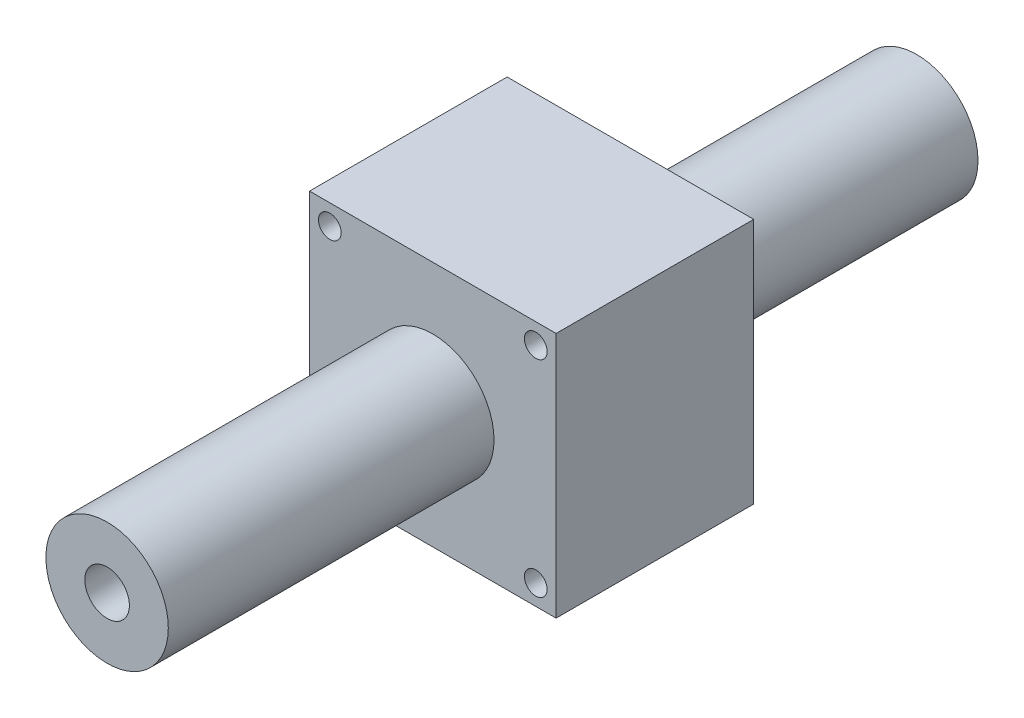
ISO-10303-21;
HEADER;
FILE_DESCRIPTION(('STEP AP214'),'2;1');
FILE_NAME('part.step','',(''),(''),'','','');
FILE_SCHEMA(('AUTOMOTIVE_DESIGN { 1 0 10303 214 1 1 1 1 }'));
ENDSEC;
DATA;
#1=APPLICATION_CONTEXT('core data for automotive mechanical design processes');
#2=APPLICATION_PROTOCOL_DEFINITION('international standard','automotive_design',2000,#1);
#3=PRODUCT_CONTEXT('',#1,'mechanical');
#4=PRODUCT('Part','Part','',(#3));
#5=PRODUCT_RELATED_PRODUCT_CATEGORY('part','',(#4));
#6=PRODUCT_DEFINITION_FORMATION('','',#4);
#7=PRODUCT_DEFINITION_CONTEXT('part definition',#1,'design');
#8=PRODUCT_DEFINITION('design','',#6,#7);
#9=PRODUCT_DEFINITION_SHAPE('','',#8);
#10=(LENGTH_UNIT() NAMED_UNIT(*) SI_UNIT(.MILLI.,.METRE.));
#11=(NAMED_UNIT(*) PLANE_ANGLE_UNIT() SI_UNIT($,.RADIAN.));
#12=(NAMED_UNIT(*) SI_UNIT($,.STERADIAN.) SOLID_ANGLE_UNIT());
#13=UNCERTAINTY_MEASURE_WITH_UNIT(LENGTH_MEASURE(1.E-05),#10,'distance_accuracy_value','');
#14=(GEOMETRIC_REPRESENTATION_CONTEXT(3) GLOBAL_UNCERTAINTY_ASSIGNED_CONTEXT((#13)) GLOBAL_UNIT_ASSIGNED_CONTEXT((#10,
#11,#12)) REPRESENTATION_CONTEXT('',''));
#15=CARTESIAN_POINT('',(0.,0.,0.));
#16=DIRECTION('',(0.,0.,1.));
#17=DIRECTION('',(1.,0.,0.));
#18=AXIS2_PLACEMENT_3D('',#15,#16,#17);
#19=CARTESIAN_POINT('',(0.,0.,0.));
#20=DIRECTION('',(0.,0.,-1.));
#21=DIRECTION('',(-1.,0.,0.));
#22=AXIS2_PLACEMENT_3D('',#19,#20,#21);
#23=PLANE('',#22);
#24=CARTESIAN_POINT('',(0.,0.,0.));
#25=DIRECTION('',(0.,0.,1.));
#26=DIRECTION('',(1.,0.,0.));
#27=AXIS2_PLACEMENT_3D('',#24,#25,#26);
#28=CIRCLE('',#27,14.);
#29=CARTESIAN_POINT('',(14.,0.,0.));
#30=VERTEX_POINT('',#29);
#31=EDGE_CURVE('E11',#30,#30,#28,.T.);
#32=ORIENTED_EDGE('',*,*,#31,.F.);
#33=EDGE_LOOP('',(#32));
#34=FACE_BOUND('',#33,.T.);
#35=DIRECTION('',(0.,-1.,0.));
#36=VECTOR('',#35,1.);
#37=CARTESIAN_POINT('',(-28.2,-28.2,0.));
#38=LINE('',#37,#36);
#39=CARTESIAN_POINT('',(-28.2,28.2,0.));
#40=VERTEX_POINT('',#39);
#41=CARTESIAN_POINT('',(-28.2,-28.2,0.));
#42=VERTEX_POINT('',#41);
#43=EDGE_CURVE('E91',#40,#42,#38,.T.);
#44=ORIENTED_EDGE('',*,*,#43,.T.);
#45=DIRECTION('',(1.,0.,0.));
#46=VECTOR('',#45,1.);
#47=CARTESIAN_POINT('',(-28.2,-28.2,0.));
#48=LINE('',#47,#46);
#49=CARTESIAN_POINT('',(28.2,-28.2,0.));
#50=VERTEX_POINT('',#49);
#51=EDGE_CURVE('E86',#42,#50,#48,.T.);
#52=ORIENTED_EDGE('',*,*,#51,.T.);
#53=DIRECTION('',(0.,1.,0.));
#54=VECTOR('',#53,1.);
#55=CARTESIAN_POINT('',(28.2,-28.2,0.));
#56=LINE('',#55,#54);
#57=CARTESIAN_POINT('',(28.2,28.2,0.));
#58=VERTEX_POINT('',#57);
#59=EDGE_CURVE('E93',#50,#58,#56,.T.);
#60=ORIENTED_EDGE('',*,*,#59,.T.);
#61=DIRECTION('',(-1.,0.,0.));
#62=VECTOR('',#61,1.);
#63=CARTESIAN_POINT('',(-28.2,28.2,0.));
#64=LINE('',#63,#62);
#65=EDGE_CURVE('E60',#58,#40,#64,.T.);
#66=ORIENTED_EDGE('',*,*,#65,.T.);
#67=EDGE_LOOP('',(#44,#52,#60,#66));
#68=FACE_BOUND('',#67,.T.);
#69=CARTESIAN_POINT('',(-23.55,-23.55,0.));
#70=DIRECTION('',(0.,0.,1.));
#71=DIRECTION('',(1.,0.,0.));
#72=AXIS2_PLACEMENT_3D('',#69,#70,#71);
#73=CIRCLE('',#72,2.6);
#74=CARTESIAN_POINT('',(-20.95,-23.55,0.));
#75=VERTEX_POINT('',#74);
#76=EDGE_CURVE('E108',#75,#75,#73,.T.);
#77=ORIENTED_EDGE('',*,*,#76,.F.);
#78=EDGE_LOOP('',(#77));
#79=FACE_BOUND('',#78,.T.);
#80=CARTESIAN_POINT('',(-23.55,23.55,0.));
#81=DIRECTION('',(0.,0.,1.));
#82=DIRECTION('',(1.,0.,0.));
#83=AXIS2_PLACEMENT_3D('',#80,#81,#82);
#84=CIRCLE('',#83,2.6);
#85=CARTESIAN_POINT('',(-20.95,23.55,0.));
#86=VERTEX_POINT('',#85);
#87=EDGE_CURVE('E121',#86,#86,#84,.T.);
#88=ORIENTED_EDGE('',*,*,#87,.F.);
#89=EDGE_LOOP('',(#88));
#90=FACE_BOUND('',#89,.T.);
#91=CARTESIAN_POINT('',(23.55,-23.55,0.));
#92=DIRECTION('',(0.,0.,1.));
#93=DIRECTION('',(1.,0.,0.));
#94=AXIS2_PLACEMENT_3D('',#91,#92,#93);
#95=CIRCLE('',#94,2.6);
#96=CARTESIAN_POINT('',(26.15,-23.55,0.));
#97=VERTEX_POINT('',#96);
#98=EDGE_CURVE('E128',#97,#97,#95,.T.);
#99=ORIENTED_EDGE('',*,*,#98,.F.);
#100=EDGE_LOOP('',(#99));
#101=FACE_BOUND('',#100,.T.);
#102=CARTESIAN_POINT('',(23.55,23.55,0.));
#103=DIRECTION('',(0.,0.,1.));
#104=DIRECTION('',(1.,0.,0.));
#105=AXIS2_PLACEMENT_3D('',#102,#103,#104);
#106=CIRCLE('',#105,2.6);
#107=CARTESIAN_POINT('',(26.15,23.55,0.));
#108=VERTEX_POINT('',#107);
#109=EDGE_CURVE('E137',#108,#108,#106,.T.);
#110=ORIENTED_EDGE('',*,*,#109,.F.);
#111=EDGE_LOOP('',(#110));
#112=FACE_BOUND('',#111,.T.);
#113=ADVANCED_FACE('F39',(#34,#68,#79,#90,#101,#112),#23,.F.);
#114=CARTESIAN_POINT('',(0.,0.,-45.2));
#115=DIRECTION('',(0.,0.,-1.));
#116=DIRECTION('',(-1.,0.,0.));
#117=AXIS2_PLACEMENT_3D('',#114,#115,#116);
#118=PLANE('',#117);
#119=CARTESIAN_POINT('',(0.,0.,-45.2));
#120=DIRECTION('',(0.,0.,1.));
#121=DIRECTION('',(1.,0.,0.));
#122=AXIS2_PLACEMENT_3D('',#119,#120,#121);
#123=CIRCLE('',#122,14.);
#124=CARTESIAN_POINT('',(14.,0.,-45.2));
#125=VERTEX_POINT('',#124);
#126=EDGE_CURVE('E142',#125,#125,#123,.T.);
#127=ORIENTED_EDGE('',*,*,#126,.T.);
#128=EDGE_LOOP('',(#127));
#129=FACE_BOUND('',#128,.T.);
#130=CARTESIAN_POINT('',(23.55,-23.55,-45.2));
#131=DIRECTION('',(0.,0.,1.));
#132=DIRECTION('',(1.,0.,0.));
#133=AXIS2_PLACEMENT_3D('',#130,#131,#132);
#134=CIRCLE('',#133,2.6);
#135=CARTESIAN_POINT('',(26.15,-23.55,-45.2));
#136=VERTEX_POINT('',#135);
#137=EDGE_CURVE('E134',#136,#136,#134,.T.);
#138=ORIENTED_EDGE('',*,*,#137,.T.);
#139=EDGE_LOOP('',(#138));
#140=FACE_BOUND('',#139,.T.);
#141=CARTESIAN_POINT('',(-23.55,-23.55,-45.2));
#142=DIRECTION('',(0.,0.,1.));
#143=DIRECTION('',(1.,0.,0.));
#144=AXIS2_PLACEMENT_3D('',#141,#142,#143);
#145=CIRCLE('',#144,2.6);
#146=CARTESIAN_POINT('',(-20.95,-23.55,-45.2));
#147=VERTEX_POINT('',#146);
#148=EDGE_CURVE('E122',#147,#147,#145,.T.);
#149=ORIENTED_EDGE('',*,*,#148,.T.);
#150=EDGE_LOOP('',(#149));
#151=FACE_BOUND('',#150,.T.);
#152=DIRECTION('',(0.,-1.,0.));
#153=VECTOR('',#152,1.);
#154=CARTESIAN_POINT('',(-28.2,-28.2,-45.2));
#155=LINE('',#154,#153);
#156=CARTESIAN_POINT('',(-28.2,28.2,-45.2));
#157=VERTEX_POINT('',#156);
#158=CARTESIAN_POINT('',(-28.2,-28.2,-45.2));
#159=VERTEX_POINT('',#158);
#160=EDGE_CURVE('E106',#157,#159,#155,.T.);
#161=ORIENTED_EDGE('',*,*,#160,.F.);
#162=DIRECTION('',(-1.,0.,0.));
#163=VECTOR('',#162,1.);
#164=CARTESIAN_POINT('',(-28.2,28.2,-45.2));
#165=LINE('',#164,#163);
#166=CARTESIAN_POINT('',(28.2,28.2,-45.2));
#167=VERTEX_POINT('',#166);
#168=EDGE_CURVE('E78',#167,#157,#165,.T.);
#169=ORIENTED_EDGE('',*,*,#168,.F.);
#170=DIRECTION('',(0.,1.,0.));
#171=VECTOR('',#170,1.);
#172=CARTESIAN_POINT('',(28.2,-28.2,-45.2));
#173=LINE('',#172,#171);
#174=CARTESIAN_POINT('',(28.2,-28.2,-45.2));
#175=VERTEX_POINT('',#174);
#176=EDGE_CURVE('E74',#175,#167,#173,.T.);
#177=ORIENTED_EDGE('',*,*,#176,.F.);
#178=DIRECTION('',(1.,0.,0.));
#179=VECTOR('',#178,1.);
#180=CARTESIAN_POINT('',(-28.2,-28.2,-45.2));
#181=LINE('',#180,#179);
#182=EDGE_CURVE('E98',#159,#175,#181,.T.);
#183=ORIENTED_EDGE('',*,*,#182,.F.);
#184=EDGE_LOOP('',(#161,#169,#177,#183));
#185=FACE_BOUND('',#184,.T.);
#186=CARTESIAN_POINT('',(-23.55,23.55,-45.2));
#187=DIRECTION('',(0.,0.,1.));
#188=DIRECTION('',(1.,0.,0.));
#189=AXIS2_PLACEMENT_3D('',#186,#187,#188);
#190=CIRCLE('',#189,2.6);
#191=CARTESIAN_POINT('',(-20.95,23.55,-45.2));
#192=VERTEX_POINT('',#191);
#193=EDGE_CURVE('E130',#192,#192,#190,.T.);
#194=ORIENTED_EDGE('',*,*,#193,.T.);
#195=EDGE_LOOP('',(#194));
#196=FACE_BOUND('',#195,.T.);
#197=CARTESIAN_POINT('',(23.55,23.55,-45.2));
#198=DIRECTION('',(0.,0.,1.));
#199=DIRECTION('',(1.,0.,0.));
#200=AXIS2_PLACEMENT_3D('',#197,#198,#199);
#201=CIRCLE('',#200,2.6);
#202=CARTESIAN_POINT('',(26.15,23.55,-45.2));
#203=VERTEX_POINT('',#202);
#204=EDGE_CURVE('E136',#203,#203,#201,.T.);
#205=ORIENTED_EDGE('',*,*,#204,.T.);
#206=EDGE_LOOP('',(#205));
#207=FACE_BOUND('',#206,.T.);
#208=ADVANCED_FACE('F120',(#129,#140,#151,#185,#196,#207),#118,.T.);
#209=CARTESIAN_POINT('',(-28.2,-28.2,0.));
#210=DIRECTION('',(1.,0.,0.));
#211=DIRECTION('',(0.,0.,-1.));
#212=AXIS2_PLACEMENT_3D('',#209,#210,#211);
#213=PLANE('',#212);
#214=ORIENTED_EDGE('',*,*,#160,.T.);
#215=DIRECTION('',(0.,0.,-1.));
#216=VECTOR('',#215,1.);
#217=CARTESIAN_POINT('',(-28.2,-28.2,0.));
#218=LINE('',#217,#216);
#219=EDGE_CURVE('E43',#42,#159,#218,.T.);
#220=ORIENTED_EDGE('',*,*,#219,.F.);
#221=ORIENTED_EDGE('',*,*,#43,.F.);
#222=DIRECTION('',(0.,0.,-1.));
#223=VECTOR('',#222,1.);
#224=CARTESIAN_POINT('',(-28.2,28.2,0.));
#225=LINE('',#224,#223);
#226=EDGE_CURVE('E105',#40,#157,#225,.T.);
#227=ORIENTED_EDGE('',*,*,#226,.T.);
#228=EDGE_LOOP('',(#214,#220,#221,#227));
#229=FACE_BOUND('',#228,.T.);
#230=ADVANCED_FACE('F41',(#229),#213,.F.);
#231=CARTESIAN_POINT('',(-28.2,-28.2,0.));
#232=DIRECTION('',(0.,1.,0.));
#233=DIRECTION('',(0.,0.,1.));
#234=AXIS2_PLACEMENT_3D('',#231,#232,#233);
#235=PLANE('',#234);
#236=ORIENTED_EDGE('',*,*,#182,.T.);
#237=DIRECTION('',(0.,0.,-1.));
#238=VECTOR('',#237,1.);
#239=CARTESIAN_POINT('',(28.2,-28.2,0.));
#240=LINE('',#239,#238);
#241=EDGE_CURVE('E96',#50,#175,#240,.T.);
#242=ORIENTED_EDGE('',*,*,#241,.F.);
#243=ORIENTED_EDGE('',*,*,#51,.F.);
#244=ORIENTED_EDGE('',*,*,#219,.T.);
#245=EDGE_LOOP('',(#236,#242,#243,#244));
#246=FACE_BOUND('',#245,.T.);
#247=ADVANCED_FACE('F100',(#246),#235,.F.);
#248=CARTESIAN_POINT('',(28.2,-28.2,0.));
#249=DIRECTION('',(-1.,0.,0.));
#250=DIRECTION('',(0.,0.,1.));
#251=AXIS2_PLACEMENT_3D('',#248,#249,#250);
#252=PLANE('',#251);
#253=ORIENTED_EDGE('',*,*,#176,.T.);
#254=DIRECTION('',(0.,0.,-1.));
#255=VECTOR('',#254,1.);
#256=CARTESIAN_POINT('',(28.2,28.2,0.));
#257=LINE('',#256,#255);
#258=EDGE_CURVE('E97',#58,#167,#257,.T.);
#259=ORIENTED_EDGE('',*,*,#258,.F.);
#260=ORIENTED_EDGE('',*,*,#59,.F.);
#261=ORIENTED_EDGE('',*,*,#241,.T.);
#262=EDGE_LOOP('',(#253,#259,#260,#261));
#263=FACE_BOUND('',#262,.T.);
#264=ADVANCED_FACE('F99',(#263),#252,.F.);
#265=CARTESIAN_POINT('',(-28.2,28.2,0.));
#266=DIRECTION('',(0.,-1.,0.));
#267=DIRECTION('',(0.,0.,-1.));
#268=AXIS2_PLACEMENT_3D('',#265,#266,#267);
#269=PLANE('',#268);
#270=ORIENTED_EDGE('',*,*,#168,.T.);
#271=ORIENTED_EDGE('',*,*,#226,.F.);
#272=ORIENTED_EDGE('',*,*,#65,.F.);
#273=ORIENTED_EDGE('',*,*,#258,.T.);
#274=EDGE_LOOP('',(#270,#271,#272,#273));
#275=FACE_BOUND('',#274,.T.);
#276=ADVANCED_FACE('F111',(#275),#269,.F.);
#277=CARTESIAN_POINT('',(-23.55,-23.55,0.));
#278=DIRECTION('',(0.,0.,-1.));
#279=DIRECTION('',(-1.,0.,0.));
#280=AXIS2_PLACEMENT_3D('',#277,#278,#279);
#281=CYLINDRICAL_SURFACE('',#280,2.6);
#282=ORIENTED_EDGE('',*,*,#76,.T.);
#283=EDGE_LOOP('',(#282));
#284=FACE_BOUND('',#283,.T.);
#285=ORIENTED_EDGE('',*,*,#148,.F.);
#286=EDGE_LOOP('',(#285));
#287=FACE_BOUND('',#286,.T.);
#288=ADVANCED_FACE('F260',(#284,#287),#281,.F.);
#289=CARTESIAN_POINT('',(-23.55,23.55,0.));
#290=DIRECTION('',(0.,0.,-1.));
#291=DIRECTION('',(-1.,0.,0.));
#292=AXIS2_PLACEMENT_3D('',#289,#290,#291);
#293=CYLINDRICAL_SURFACE('',#292,2.6);
#294=ORIENTED_EDGE('',*,*,#87,.T.);
#295=EDGE_LOOP('',(#294));
#296=FACE_BOUND('',#295,.T.);
#297=ORIENTED_EDGE('',*,*,#193,.F.);
#298=EDGE_LOOP('',(#297));
#299=FACE_BOUND('',#298,.T.);
#300=ADVANCED_FACE('F250',(#296,#299),#293,.F.);
#301=CARTESIAN_POINT('',(23.55,-23.55,0.));
#302=DIRECTION('',(0.,0.,-1.));
#303=DIRECTION('',(-1.,0.,0.));
#304=AXIS2_PLACEMENT_3D('',#301,#302,#303);
#305=CYLINDRICAL_SURFACE('',#304,2.6);
#306=ORIENTED_EDGE('',*,*,#98,.T.);
#307=EDGE_LOOP('',(#306));
#308=FACE_BOUND('',#307,.T.);
#309=ORIENTED_EDGE('',*,*,#137,.F.);
#310=EDGE_LOOP('',(#309));
#311=FACE_BOUND('',#310,.T.);
#312=ADVANCED_FACE('F240',(#308,#311),#305,.F.);
#313=CARTESIAN_POINT('',(23.55,23.55,0.));
#314=DIRECTION('',(0.,0.,-1.));
#315=DIRECTION('',(-1.,0.,0.));
#316=AXIS2_PLACEMENT_3D('',#313,#314,#315);
#317=CYLINDRICAL_SURFACE('',#316,2.6);
#318=ORIENTED_EDGE('',*,*,#109,.T.);
#319=EDGE_LOOP('',(#318));
#320=FACE_BOUND('',#319,.T.);
#321=ORIENTED_EDGE('',*,*,#204,.F.);
#322=EDGE_LOOP('',(#321));
#323=FACE_BOUND('',#322,.T.);
#324=ADVANCED_FACE('F230',(#320,#323),#317,.F.);
#325=CARTESIAN_POINT('',(0.,0.,-45.2));
#326=DIRECTION('',(0.,0.,-1.));
#327=DIRECTION('',(-1.,0.,0.));
#328=AXIS2_PLACEMENT_3D('',#325,#326,#327);
#329=CYLINDRICAL_SURFACE('',#328,14.);
#330=ORIENTED_EDGE('',*,*,#126,.F.);
#331=EDGE_LOOP('',(#330));
#332=FACE_BOUND('',#331,.T.);
#333=CARTESIAN_POINT('',(0.,0.,-110.7));
#334=DIRECTION('',(0.,0.,1.));
#335=DIRECTION('',(1.,0.,0.));
#336=AXIS2_PLACEMENT_3D('',#333,#334,#335);
#337=CIRCLE('',#336,14.);
#338=CARTESIAN_POINT('',(14.,0.,-110.7));
#339=VERTEX_POINT('',#338);
#340=EDGE_CURVE('E144',#339,#339,#337,.T.);
#341=ORIENTED_EDGE('',*,*,#340,.T.);
#342=EDGE_LOOP('',(#341));
#343=FACE_BOUND('',#342,.T.);
#344=ADVANCED_FACE('F177',(#332,#343),#329,.T.);
#345=CARTESIAN_POINT('',(0.,0.,-110.7));
#346=DIRECTION('',(0.,0.,1.));
#347=DIRECTION('',(1.,0.,0.));
#348=AXIS2_PLACEMENT_3D('',#345,#346,#347);
#349=PLANE('',#348);
#350=ORIENTED_EDGE('',*,*,#340,.F.);
#351=EDGE_LOOP('',(#350));
#352=FACE_BOUND('',#351,.T.);
#353=ADVANCED_FACE('F167',(#352),#349,.F.);
#354=CARTESIAN_POINT('',(0.,0.,74.5));
#355=DIRECTION('',(0.,0.,1.));
#356=DIRECTION('',(1.,0.,0.));
#357=AXIS2_PLACEMENT_3D('',#354,#355,#356);
#358=PLANE('',#357);
#359=CARTESIAN_POINT('',(0.,0.,74.5));
#360=DIRECTION('',(0.,0.,1.));
#361=DIRECTION('',(1.,0.,0.));
#362=AXIS2_PLACEMENT_3D('',#359,#360,#361);
#363=CIRCLE('',#362,14.);
#364=CARTESIAN_POINT('',(14.,0.,74.5));
#365=VERTEX_POINT('',#364);
#366=EDGE_CURVE('E146',#365,#365,#363,.T.);
#367=ORIENTED_EDGE('',*,*,#366,.T.);
#368=EDGE_LOOP('',(#367));
#369=FACE_BOUND('',#368,.T.);
#370=CARTESIAN_POINT('',(0.,0.,74.5));
#371=DIRECTION('',(0.,0.,1.));
#372=DIRECTION('',(1.,0.,0.));
#373=AXIS2_PLACEMENT_3D('',#370,#371,#372);
#374=CIRCLE('',#373,5.1);
#375=CARTESIAN_POINT('',(5.1,0.,74.5));
#376=VERTEX_POINT('',#375);
#377=EDGE_CURVE('E153',#376,#376,#374,.T.);
#378=ORIENTED_EDGE('',*,*,#377,.F.);
#379=EDGE_LOOP('',(#378));
#380=FACE_BOUND('',#379,.T.);
#381=ADVANCED_FACE('F162',(#369,#380),#358,.T.);
#382=CARTESIAN_POINT('',(0.,0.,74.5));
#383=DIRECTION('',(0.,0.,-1.));
#384=DIRECTION('',(-1.,0.,0.));
#385=AXIS2_PLACEMENT_3D('',#382,#383,#384);
#386=CYLINDRICAL_SURFACE('',#385,14.);
#387=ORIENTED_EDGE('',*,*,#366,.F.);
#388=EDGE_LOOP('',(#387));
#389=FACE_BOUND('',#388,.T.);
#390=ORIENTED_EDGE('',*,*,#31,.T.);
#391=EDGE_LOOP('',(#390));
#392=FACE_BOUND('',#391,.T.);
#393=ADVANCED_FACE('F164',(#389,#392),#386,.T.);
#394=CARTESIAN_POINT('',(0.,0.,74.5));
#395=DIRECTION('',(0.,0.,-1.));
#396=DIRECTION('',(-1.,0.,0.));
#397=AXIS2_PLACEMENT_3D('',#394,#395,#396);
#398=CYLINDRICAL_SURFACE('',#397,5.1);
#399=ORIENTED_EDGE('',*,*,#377,.T.);
#400=EDGE_LOOP('',(#399));
#401=FACE_BOUND('',#400,.T.);
#402=CARTESIAN_POINT('',(0.,0.,0.));
#403=DIRECTION('',(0.,0.,1.));
#404=DIRECTION('',(1.,0.,0.));
#405=AXIS2_PLACEMENT_3D('',#402,#403,#404);
#406=CIRCLE('',#405,5.1);
#407=CARTESIAN_POINT('',(5.1,0.,0.));
#408=VERTEX_POINT('',#407);
#409=EDGE_CURVE('E152',#408,#408,#406,.T.);
#410=ORIENTED_EDGE('',*,*,#409,.F.);
#411=EDGE_LOOP('',(#410));
#412=FACE_BOUND('',#411,.T.);
#413=ADVANCED_FACE('F159',(#401,#412),#398,.F.);
#414=ORIENTED_EDGE('',*,*,#409,.T.);
#415=EDGE_LOOP('',(#414));
#416=FACE_BOUND('',#415,.T.);
#417=ADVANCED_FACE('F185',(#416),#23,.F.);
#418=CLOSED_SHELL('',(#113,#208,#230,#247,#264,#276,#288,#300,#312,#324,#344,#353,#381,#393,
#413,#417));
#419=MANIFOLD_SOLID_BREP('B2',#418);
#420=ADVANCED_BREP_SHAPE_REPRESENTATION('',(#18,#419),#14);
#421=SHAPE_DEFINITION_REPRESENTATION(#9,#420);
ENDSEC;
END-ISO-10303-21;
